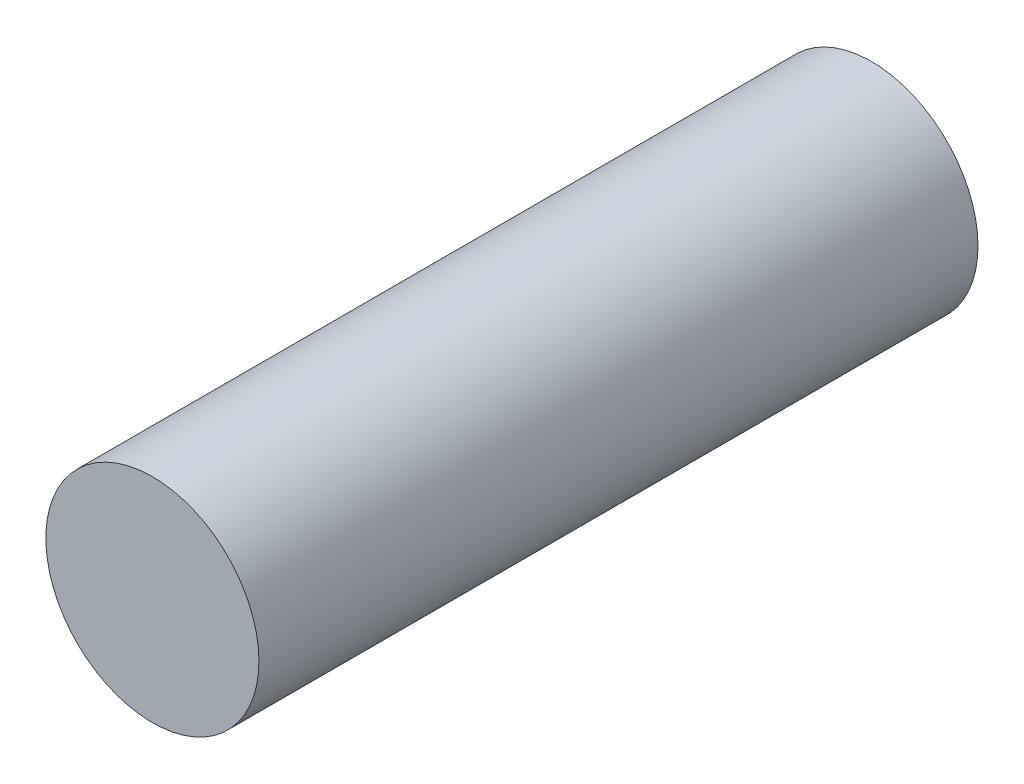
ISO-10303-21;
HEADER;
FILE_DESCRIPTION(('STEP AP214'),'2;1');
FILE_NAME('part.step','',(''),(''),'','','');
FILE_SCHEMA(('AUTOMOTIVE_DESIGN { 1 0 10303 214 1 1 1 1 }'));
ENDSEC;
DATA;
#1=APPLICATION_CONTEXT('core data for automotive mechanical design processes');
#2=APPLICATION_PROTOCOL_DEFINITION('international standard','automotive_design',2000,#1);
#3=PRODUCT_CONTEXT('',#1,'mechanical');
#4=PRODUCT('Part','Part','',(#3));
#5=PRODUCT_RELATED_PRODUCT_CATEGORY('part','',(#4));
#6=PRODUCT_DEFINITION_FORMATION('','',#4);
#7=PRODUCT_DEFINITION_CONTEXT('part definition',#1,'design');
#8=PRODUCT_DEFINITION('design','',#6,#7);
#9=PRODUCT_DEFINITION_SHAPE('','',#8);
#10=(LENGTH_UNIT() NAMED_UNIT(*) SI_UNIT(.MILLI.,.METRE.));
#11=(NAMED_UNIT(*) PLANE_ANGLE_UNIT() SI_UNIT($,.RADIAN.));
#12=(NAMED_UNIT(*) SI_UNIT($,.STERADIAN.) SOLID_ANGLE_UNIT());
#13=UNCERTAINTY_MEASURE_WITH_UNIT(LENGTH_MEASURE(1.E-05),#10,'distance_accuracy_value','');
#14=(GEOMETRIC_REPRESENTATION_CONTEXT(3) GLOBAL_UNCERTAINTY_ASSIGNED_CONTEXT((#13)) GLOBAL_UNIT_ASSIGNED_CONTEXT((#10,
#11,#12)) REPRESENTATION_CONTEXT('',''));
#15=CARTESIAN_POINT('',(0.,0.,0.));
#16=DIRECTION('',(0.,0.,1.));
#17=DIRECTION('',(1.,0.,0.));
#18=AXIS2_PLACEMENT_3D('',#15,#16,#17);
#19=CARTESIAN_POINT('',(0.,0.,30.));
#20=DIRECTION('',(0.,0.,-1.));
#21=DIRECTION('',(-1.,0.,0.));
#22=AXIS2_PLACEMENT_3D('',#19,#20,#21);
#23=CYLINDRICAL_SURFACE('',#22,4.445);
#24=CARTESIAN_POINT('',(0.,0.,30.));
#25=DIRECTION('',(0.,0.,1.));
#26=DIRECTION('',(1.,0.,0.));
#27=AXIS2_PLACEMENT_3D('',#24,#25,#26);
#28=CIRCLE('',#27,4.445);
#29=CARTESIAN_POINT('',(4.445,0.,30.));
#30=VERTEX_POINT('',#29);
#31=EDGE_CURVE('E11',#30,#30,#28,.T.);
#32=ORIENTED_EDGE('',*,*,#31,.F.);
#33=EDGE_LOOP('',(#32));
#34=FACE_BOUND('',#33,.T.);
#35=CARTESIAN_POINT('',(0.,0.,0.));
#36=DIRECTION('',(0.,0.,1.));
#37=DIRECTION('',(1.,0.,0.));
#38=AXIS2_PLACEMENT_3D('',#35,#36,#37);
#39=CIRCLE('',#38,4.445);
#40=CARTESIAN_POINT('',(4.445,0.,0.));
#41=VERTEX_POINT('',#40);
#42=EDGE_CURVE('E36',#41,#41,#39,.T.);
#43=ORIENTED_EDGE('',*,*,#42,.T.);
#44=EDGE_LOOP('',(#43));
#45=FACE_BOUND('',#44,.T.);
#46=ADVANCED_FACE('F33',(#34,#45),#23,.T.);
#47=CARTESIAN_POINT('',(0.,0.,30.));
#48=DIRECTION('',(0.,0.,1.));
#49=DIRECTION('',(1.,0.,0.));
#50=AXIS2_PLACEMENT_3D('',#47,#48,#49);
#51=PLANE('',#50);
#52=ORIENTED_EDGE('',*,*,#31,.T.);
#53=EDGE_LOOP('',(#52));
#54=FACE_BOUND('',#53,.T.);
#55=ADVANCED_FACE('F62',(#54),#51,.T.);
#56=CARTESIAN_POINT('',(0.,0.,0.));
#57=DIRECTION('',(0.,0.,1.));
#58=DIRECTION('',(1.,0.,0.));
#59=AXIS2_PLACEMENT_3D('',#56,#57,#58);
#60=PLANE('',#59);
#61=CARTESIAN_POINT('',(0.,0.,0.));
#62=DIRECTION('',(0.,0.,-1.));
#63=DIRECTION('',(-1.,0.,0.));
#64=AXIS2_PLACEMENT_3D('',#61,#62,#63);
#65=CIRCLE('',#64,3.39999999999999);
#66=CARTESIAN_POINT('',(-3.39999999999999,0.,0.));
#67=VERTEX_POINT('',#66);
#68=EDGE_CURVE('E52',#67,#67,#65,.T.);
#69=ORIENTED_EDGE('',*,*,#68,.F.);
#70=EDGE_LOOP('',(#69));
#71=FACE_BOUND('',#70,.T.);
#72=ORIENTED_EDGE('',*,*,#42,.F.);
#73=EDGE_LOOP('',(#72));
#74=FACE_BOUND('',#73,.T.);
#75=ADVANCED_FACE('F46',(#71,#74),#60,.F.);
#76=CARTESIAN_POINT('',(0.,0.,9.525));
#77=DIRECTION('',(0.,0.,-1.));
#78=DIRECTION('',(-1.,0.,0.));
#79=AXIS2_PLACEMENT_3D('',#76,#77,#78);
#80=CONICAL_SURFACE('',#79,3.4,1.02974425867665);
#81=CARTESIAN_POINT('',(0.,0.,11.5679261046937));
#82=VERTEX_POINT('',#81);
#83=VERTEX_LOOP('',#82);
#84=FACE_BOUND('',#83,.T.);
#85=CARTESIAN_POINT('',(0.,0.,9.525));
#86=DIRECTION('',(0.,0.,-1.));
#87=DIRECTION('',(-1.,0.,0.));
#88=AXIS2_PLACEMENT_3D('',#85,#86,#87);
#89=CIRCLE('',#88,3.4);
#90=CARTESIAN_POINT('',(-3.4,0.,9.525));
#91=VERTEX_POINT('',#90);
#92=EDGE_CURVE('E50',#91,#91,#89,.T.);
#93=ORIENTED_EDGE('',*,*,#92,.T.);
#94=EDGE_LOOP('',(#93));
#95=FACE_BOUND('',#94,.T.);
#96=ADVANCED_FACE('F42',(#84,#95),#80,.F.);
#97=CARTESIAN_POINT('',(0.,0.,0.));
#98=DIRECTION('',(0.,0.,-1.));
#99=DIRECTION('',(-1.,0.,0.));
#100=AXIS2_PLACEMENT_3D('',#97,#98,#99);
#101=CYLINDRICAL_SURFACE('',#100,3.39999999999999);
#102=ORIENTED_EDGE('',*,*,#92,.F.);
#103=EDGE_LOOP('',(#102));
#104=FACE_BOUND('',#103,.T.);
#105=ORIENTED_EDGE('',*,*,#68,.T.);
#106=EDGE_LOOP('',(#105));
#107=FACE_BOUND('',#106,.T.);
#108=ADVANCED_FACE('F45',(#104,#107),#101,.F.);
#109=CLOSED_SHELL('',(#46,#55,#75,#96,#108));
#110=MANIFOLD_SOLID_BREP('B2',#109);
#111=ADVANCED_BREP_SHAPE_REPRESENTATION('',(#18,#110),#14);
#112=SHAPE_DEFINITION_REPRESENTATION(#9,#111);
ENDSEC;
END-ISO-10303-21;
